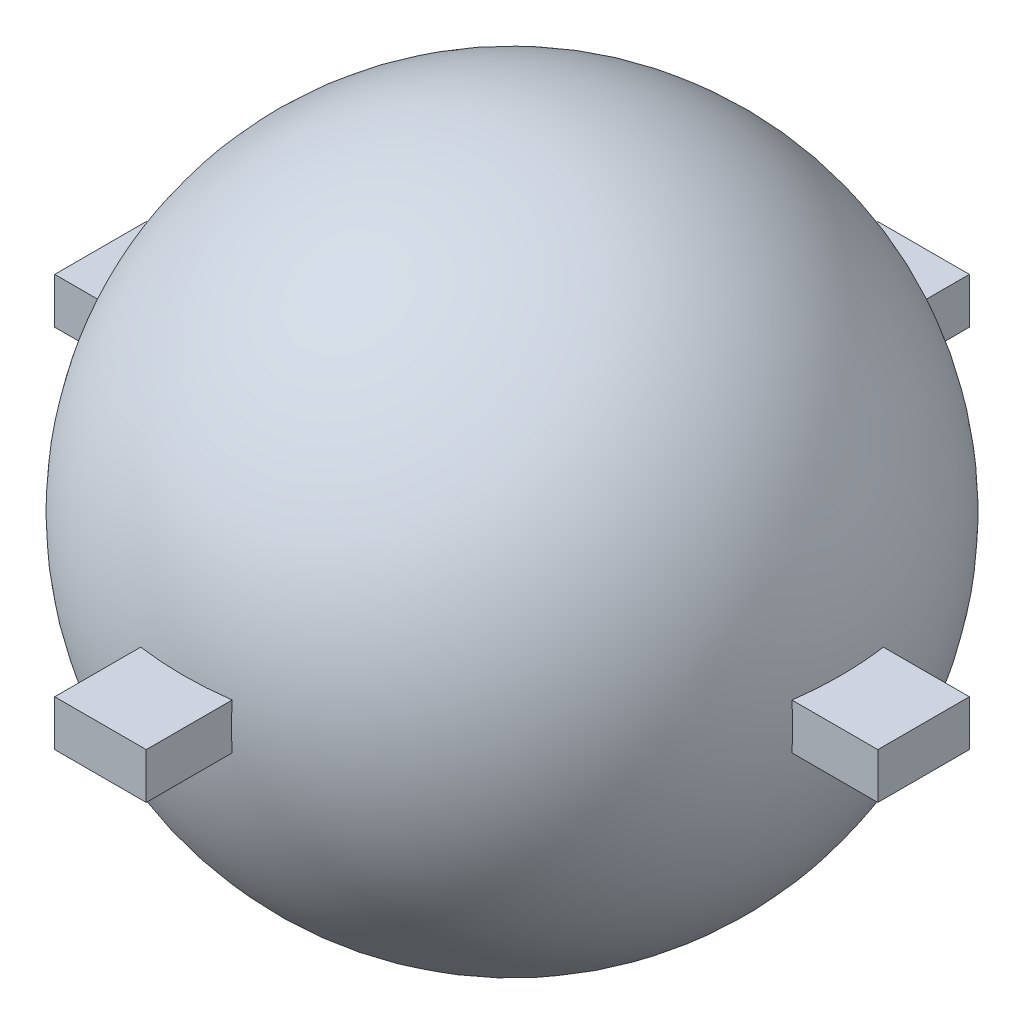
ISO-10303-21;
HEADER;
FILE_DESCRIPTION(('STEP AP214'),'2;1');
FILE_NAME('part.step','',(''),(''),'','','');
FILE_SCHEMA(('AUTOMOTIVE_DESIGN { 1 0 10303 214 1 1 1 1 }'));
ENDSEC;
DATA;
#1=APPLICATION_CONTEXT('core data for automotive mechanical design processes');
#2=APPLICATION_PROTOCOL_DEFINITION('international standard','automotive_design',2000,#1);
#3=PRODUCT_CONTEXT('',#1,'mechanical');
#4=PRODUCT('Part','Part','',(#3));
#5=PRODUCT_RELATED_PRODUCT_CATEGORY('part','',(#4));
#6=PRODUCT_DEFINITION_FORMATION('','',#4);
#7=PRODUCT_DEFINITION_CONTEXT('part definition',#1,'design');
#8=PRODUCT_DEFINITION('design','',#6,#7);
#9=PRODUCT_DEFINITION_SHAPE('','',#8);
#10=(LENGTH_UNIT() NAMED_UNIT(*) SI_UNIT(.MILLI.,.METRE.));
#11=(NAMED_UNIT(*) PLANE_ANGLE_UNIT() SI_UNIT($,.RADIAN.));
#12=(NAMED_UNIT(*) SI_UNIT($,.STERADIAN.) SOLID_ANGLE_UNIT());
#13=UNCERTAINTY_MEASURE_WITH_UNIT(LENGTH_MEASURE(1.E-05),#10,'distance_accuracy_value','');
#14=(GEOMETRIC_REPRESENTATION_CONTEXT(3) GLOBAL_UNCERTAINTY_ASSIGNED_CONTEXT((#13)) GLOBAL_UNIT_ASSIGNED_CONTEXT((#10,
#11,#12)) REPRESENTATION_CONTEXT('',''));
#15=CARTESIAN_POINT('',(0.,0.,0.));
#16=DIRECTION('',(0.,0.,1.));
#17=DIRECTION('',(1.,0.,0.));
#18=AXIS2_PLACEMENT_3D('',#15,#16,#17);
#19=CARTESIAN_POINT('',(0.,0.,342.5825));
#20=DIRECTION('',(0.,0.,-1.));
#21=DIRECTION('',(-1.,0.,0.));
#22=AXIS2_PLACEMENT_3D('',#19,#20,#21);
#23=PLANE('',#22);
#24=DIRECTION('',(0.,1.,0.));
#25=VECTOR('',#24,1.);
#26=CARTESIAN_POINT('',(38.1,-19.05,342.5825));
#27=LINE('',#26,#25);
#28=CARTESIAN_POINT('',(38.1,-19.05,342.5825));
#29=VERTEX_POINT('',#28);
#30=CARTESIAN_POINT('',(38.1,19.05,342.5825));
#31=VERTEX_POINT('',#30);
#32=EDGE_CURVE('E223',#29,#31,#27,.T.);
#33=ORIENTED_EDGE('',*,*,#32,.T.);
#34=DIRECTION('',(-1.,0.,0.));
#35=VECTOR('',#34,1.);
#36=CARTESIAN_POINT('',(-38.1,19.05,342.5825));
#37=LINE('',#36,#35);
#38=CARTESIAN_POINT('',(-38.1,19.05,342.5825));
#39=VERTEX_POINT('',#38);
#40=EDGE_CURVE('E258',#31,#39,#37,.T.);
#41=ORIENTED_EDGE('',*,*,#40,.T.);
#42=DIRECTION('',(0.,-1.,0.));
#43=VECTOR('',#42,1.);
#44=CARTESIAN_POINT('',(-38.1,-19.05,342.5825));
#45=LINE('',#44,#43);
#46=CARTESIAN_POINT('',(-38.1,-19.05,342.5825));
#47=VERTEX_POINT('',#46);
#48=EDGE_CURVE('E261',#39,#47,#45,.T.);
#49=ORIENTED_EDGE('',*,*,#48,.T.);
#50=DIRECTION('',(1.,0.,0.));
#51=VECTOR('',#50,1.);
#52=CARTESIAN_POINT('',(-38.1,-19.05,342.5825));
#53=LINE('',#52,#51);
#54=EDGE_CURVE('E264',#47,#29,#53,.T.);
#55=ORIENTED_EDGE('',*,*,#54,.T.);
#56=EDGE_LOOP('',(#33,#41,#49,#55));
#57=FACE_BOUND('',#56,.T.);
#58=ADVANCED_FACE('F37',(#57),#23,.F.);
#59=CARTESIAN_POINT('',(-38.1,19.05,-274.321));
#60=DIRECTION('',(0.,1.,0.));
#61=DIRECTION('',(0.,0.,1.));
#62=AXIS2_PLACEMENT_3D('',#59,#60,#61);
#63=PLANE('',#62);
#64=DIRECTION('',(0.,0.,1.));
#65=VECTOR('',#64,1.);
#66=CARTESIAN_POINT('',(38.1,19.05,-274.321));
#67=LINE('',#66,#65);
#68=CARTESIAN_POINT('',(38.1,19.05,270.992527387749));
#69=VERTEX_POINT('',#68);
#70=EDGE_CURVE('E267',#69,#31,#67,.T.);
#71=ORIENTED_EDGE('',*,*,#70,.F.);
#72=CARTESIAN_POINT('',(0.,19.05,0.));
#73=DIRECTION('',(0.,1.,0.));
#74=DIRECTION('',(0.,0.,1.));
#75=AXIS2_PLACEMENT_3D('',#72,#73,#74);
#76=CIRCLE('',#75,273.657742262118);
#77=CARTESIAN_POINT('',(-38.1,19.05,270.992527387749));
#78=VERTEX_POINT('',#77);
#79=EDGE_CURVE('E41',#69,#78,#76,.F.);
#80=ORIENTED_EDGE('',*,*,#79,.T.);
#81=DIRECTION('',(0.,0.,1.));
#82=VECTOR('',#81,1.);
#83=CARTESIAN_POINT('',(-38.1,19.05,-274.321));
#84=LINE('',#83,#82);
#85=EDGE_CURVE('E272',#78,#39,#84,.T.);
#86=ORIENTED_EDGE('',*,*,#85,.T.);
#87=ORIENTED_EDGE('',*,*,#40,.F.);
#88=EDGE_LOOP('',(#71,#80,#86,#87));
#89=FACE_BOUND('',#88,.T.);
#90=ADVANCED_FACE('F283',(#89),#63,.T.);
#91=CARTESIAN_POINT('',(-38.1,-19.05,-274.321));
#92=DIRECTION('',(-1.,0.,0.));
#93=DIRECTION('',(0.,0.,1.));
#94=AXIS2_PLACEMENT_3D('',#91,#92,#93);
#95=PLANE('',#94);
#96=ORIENTED_EDGE('',*,*,#85,.F.);
#97=CARTESIAN_POINT('',(-38.1,0.,0.));
#98=DIRECTION('',(-1.,0.,0.));
#99=DIRECTION('',(0.,0.,1.));
#100=AXIS2_PLACEMENT_3D('',#97,#98,#99);
#101=CIRCLE('',#100,271.661282482433);
#102=CARTESIAN_POINT('',(-38.1,-19.05,270.992527387749));
#103=VERTEX_POINT('',#102);
#104=EDGE_CURVE('E252',#78,#103,#101,.F.);
#105=ORIENTED_EDGE('',*,*,#104,.T.);
#106=DIRECTION('',(0.,0.,1.));
#107=VECTOR('',#106,1.);
#108=CARTESIAN_POINT('',(-38.1,-19.05,-274.321));
#109=LINE('',#108,#107);
#110=EDGE_CURVE('E270',#103,#47,#109,.T.);
#111=ORIENTED_EDGE('',*,*,#110,.T.);
#112=ORIENTED_EDGE('',*,*,#48,.F.);
#113=EDGE_LOOP('',(#96,#105,#111,#112));
#114=FACE_BOUND('',#113,.T.);
#115=ADVANCED_FACE('F294',(#114),#95,.T.);
#116=CARTESIAN_POINT('',(-38.1,-19.05,-274.321));
#117=DIRECTION('',(0.,-1.,0.));
#118=DIRECTION('',(0.,0.,-1.));
#119=AXIS2_PLACEMENT_3D('',#116,#117,#118);
#120=PLANE('',#119);
#121=ORIENTED_EDGE('',*,*,#110,.F.);
#122=CARTESIAN_POINT('',(0.,-19.05,0.));
#123=DIRECTION('',(0.,-1.,0.));
#124=DIRECTION('',(0.,0.,-1.));
#125=AXIS2_PLACEMENT_3D('',#122,#123,#124);
#126=CIRCLE('',#125,273.657742262118);
#127=CARTESIAN_POINT('',(38.1,-19.05,270.992527387749));
#128=VERTEX_POINT('',#127);
#129=EDGE_CURVE('E47',#103,#128,#126,.F.);
#130=ORIENTED_EDGE('',*,*,#129,.T.);
#131=DIRECTION('',(0.,0.,1.));
#132=VECTOR('',#131,1.);
#133=CARTESIAN_POINT('',(38.1,-19.05,-274.321));
#134=LINE('',#133,#132);
#135=EDGE_CURVE('E268',#128,#29,#134,.T.);
#136=ORIENTED_EDGE('',*,*,#135,.T.);
#137=ORIENTED_EDGE('',*,*,#54,.F.);
#138=EDGE_LOOP('',(#121,#130,#136,#137));
#139=FACE_BOUND('',#138,.T.);
#140=ADVANCED_FACE('F288',(#139),#120,.T.);
#141=CARTESIAN_POINT('',(38.1,-19.05,-274.321));
#142=DIRECTION('',(1.,0.,0.));
#143=DIRECTION('',(0.,0.,-1.));
#144=AXIS2_PLACEMENT_3D('',#141,#142,#143);
#145=PLANE('',#144);
#146=ORIENTED_EDGE('',*,*,#135,.F.);
#147=CARTESIAN_POINT('',(38.1,0.,0.));
#148=DIRECTION('',(1.,0.,0.));
#149=DIRECTION('',(0.,0.,-1.));
#150=AXIS2_PLACEMENT_3D('',#147,#148,#149);
#151=CIRCLE('',#150,271.661282482433);
#152=EDGE_CURVE('E11',#128,#69,#151,.F.);
#153=ORIENTED_EDGE('',*,*,#152,.T.);
#154=ORIENTED_EDGE('',*,*,#70,.T.);
#155=ORIENTED_EDGE('',*,*,#32,.F.);
#156=EDGE_LOOP('',(#146,#153,#154,#155));
#157=FACE_BOUND('',#156,.T.);
#158=ADVANCED_FACE('F278',(#157),#145,.T.);
#159=CARTESIAN_POINT('',(0.,0.,0.));
#160=DIRECTION('',(-1.,0.,0.));
#161=DIRECTION('',(0.,0.,-1.));
#162=AXIS2_PLACEMENT_3D('',#159,#160,#161);
#163=SPHERICAL_SURFACE('',#162,274.32);
#164=CARTESIAN_POINT('',(-3.9907631702977E-13,0.,38.1));
#165=DIRECTION('',(0.,0.,1.));
#166=DIRECTION('',(1.,0.,0.));
#167=AXIS2_PLACEMENT_3D('',#164,#165,#166);
#168=CIRCLE('',#167,271.661282482433);
#169=CARTESIAN_POINT('',(270.992527387749,19.05,38.1000000000028));
#170=VERTEX_POINT('',#169);
#171=CARTESIAN_POINT('',(270.992527387749,-19.05,38.1000000000028));
#172=VERTEX_POINT('',#171);
#173=EDGE_CURVE('E189',#170,#172,#168,.F.);
#174=ORIENTED_EDGE('',*,*,#173,.F.);
#175=CARTESIAN_POINT('',(0.,19.05,0.));
#176=DIRECTION('',(0.,1.,0.));
#177=DIRECTION('',(0.,0.,1.));
#178=AXIS2_PLACEMENT_3D('',#175,#176,#177);
#179=CIRCLE('',#178,273.657742262118);
#180=CARTESIAN_POINT('',(270.99252738775,19.05,-38.0999999999972));
#181=VERTEX_POINT('',#180);
#182=EDGE_CURVE('E184',#181,#170,#179,.F.);
#183=ORIENTED_EDGE('',*,*,#182,.F.);
#184=CARTESIAN_POINT('',(3.9907631702977E-13,0.,-38.1));
#185=DIRECTION('',(0.,0.,-1.));
#186=DIRECTION('',(-1.,0.,0.));
#187=AXIS2_PLACEMENT_3D('',#184,#185,#186);
#188=CIRCLE('',#187,271.661282482433);
#189=CARTESIAN_POINT('',(270.99252738775,-19.05,-38.0999999999972));
#190=VERTEX_POINT('',#189);
#191=EDGE_CURVE('E159',#190,#181,#188,.F.);
#192=ORIENTED_EDGE('',*,*,#191,.F.);
#193=CARTESIAN_POINT('',(0.,-19.05,0.));
#194=DIRECTION('',(0.,-1.,0.));
#195=DIRECTION('',(0.,0.,-1.));
#196=AXIS2_PLACEMENT_3D('',#193,#194,#195);
#197=CIRCLE('',#196,273.657742262118);
#198=EDGE_CURVE('E55',#172,#190,#197,.F.);
#199=ORIENTED_EDGE('',*,*,#198,.F.);
#200=EDGE_LOOP('',(#174,#183,#192,#199));
#201=FACE_BOUND('',#200,.T.);
#202=CARTESIAN_POINT('',(38.1,0.,0.));
#203=DIRECTION('',(1.,0.,0.));
#204=DIRECTION('',(0.,0.,-1.));
#205=AXIS2_PLACEMENT_3D('',#202,#203,#204);
#206=CIRCLE('',#205,271.661282482433);
#207=CARTESIAN_POINT('',(38.1,19.05,-270.992527387749));
#208=VERTEX_POINT('',#207);
#209=CARTESIAN_POINT('',(38.1,-19.05,-270.992527387749));
#210=VERTEX_POINT('',#209);
#211=EDGE_CURVE('E190',#208,#210,#206,.F.);
#212=ORIENTED_EDGE('',*,*,#211,.F.);
#213=CARTESIAN_POINT('',(0.,19.05,0.));
#214=DIRECTION('',(0.,1.,0.));
#215=DIRECTION('',(0.,0.,1.));
#216=AXIS2_PLACEMENT_3D('',#213,#214,#215);
#217=CIRCLE('',#216,273.657742262118);
#218=CARTESIAN_POINT('',(-38.1,19.05,-270.992527387749));
#219=VERTEX_POINT('',#218);
#220=EDGE_CURVE('E193',#219,#208,#217,.F.);
#221=ORIENTED_EDGE('',*,*,#220,.F.);
#222=CARTESIAN_POINT('',(-38.1,0.,0.));
#223=DIRECTION('',(-1.,0.,0.));
#224=DIRECTION('',(0.,0.,1.));
#225=AXIS2_PLACEMENT_3D('',#222,#223,#224);
#226=CIRCLE('',#225,271.661282482433);
#227=CARTESIAN_POINT('',(-38.1,-19.05,-270.992527387749));
#228=VERTEX_POINT('',#227);
#229=EDGE_CURVE('E195',#228,#219,#226,.F.);
#230=ORIENTED_EDGE('',*,*,#229,.F.);
#231=CARTESIAN_POINT('',(0.,-19.05,0.));
#232=DIRECTION('',(0.,-1.,0.));
#233=DIRECTION('',(0.,0.,-1.));
#234=AXIS2_PLACEMENT_3D('',#231,#232,#233);
#235=CIRCLE('',#234,273.657742262118);
#236=EDGE_CURVE('E63',#210,#228,#235,.F.);
#237=ORIENTED_EDGE('',*,*,#236,.F.);
#238=EDGE_LOOP('',(#212,#221,#230,#237));
#239=FACE_BOUND('',#238,.T.);
#240=CARTESIAN_POINT('',(0.,19.05,0.));
#241=DIRECTION('',(0.,1.,0.));
#242=DIRECTION('',(0.,0.,1.));
#243=AXIS2_PLACEMENT_3D('',#240,#241,#242);
#244=CIRCLE('',#243,273.657742262118);
#245=CARTESIAN_POINT('',(-270.992527387749,19.05,38.0999999999991));
#246=VERTEX_POINT('',#245);
#247=CARTESIAN_POINT('',(-270.992527387749,19.05,-38.1000000000009));
#248=VERTEX_POINT('',#247);
#249=EDGE_CURVE('E240',#246,#248,#244,.F.);
#250=ORIENTED_EDGE('',*,*,#249,.F.);
#251=CARTESIAN_POINT('',(-1.33025439009923E-13,0.,38.1));
#252=DIRECTION('',(0.,0.,1.));
#253=DIRECTION('',(1.,0.,0.));
#254=AXIS2_PLACEMENT_3D('',#251,#252,#253);
#255=CIRCLE('',#254,271.661282482433);
#256=CARTESIAN_POINT('',(-270.992527387749,-19.05,38.0999999999991));
#257=VERTEX_POINT('',#256);
#258=EDGE_CURVE('E197',#257,#246,#255,.F.);
#259=ORIENTED_EDGE('',*,*,#258,.F.);
#260=CARTESIAN_POINT('',(0.,-19.05,0.));
#261=DIRECTION('',(0.,-1.,0.));
#262=DIRECTION('',(0.,0.,-1.));
#263=AXIS2_PLACEMENT_3D('',#260,#261,#262);
#264=CIRCLE('',#263,273.657742262118);
#265=CARTESIAN_POINT('',(-270.992527387749,-19.05,-38.1000000000009));
#266=VERTEX_POINT('',#265);
#267=EDGE_CURVE('E237',#266,#257,#264,.F.);
#268=ORIENTED_EDGE('',*,*,#267,.F.);
#269=CARTESIAN_POINT('',(1.33025439009923E-13,0.,-38.1));
#270=DIRECTION('',(0.,0.,-1.));
#271=DIRECTION('',(-1.,0.,0.));
#272=AXIS2_PLACEMENT_3D('',#269,#270,#271);
#273=CIRCLE('',#272,271.661282482433);
#274=EDGE_CURVE('E236',#248,#266,#273,.F.);
#275=ORIENTED_EDGE('',*,*,#274,.F.);
#276=EDGE_LOOP('',(#250,#259,#268,#275));
#277=FACE_BOUND('',#276,.T.);
#278=ORIENTED_EDGE('',*,*,#104,.F.);
#279=ORIENTED_EDGE('',*,*,#79,.F.);
#280=ORIENTED_EDGE('',*,*,#152,.F.);
#281=ORIENTED_EDGE('',*,*,#129,.F.);
#282=EDGE_LOOP('',(#278,#279,#280,#281));
#283=FACE_BOUND('',#282,.T.);
#284=ADVANCED_FACE('F292',(#201,#239,#277,#283),#163,.T.);
#285=CARTESIAN_POINT('',(274.321000000001,-19.05,38.100000000001));
#286=DIRECTION('',(0.,0.,1.));
#287=DIRECTION('',(1.,0.,0.));
#288=AXIS2_PLACEMENT_3D('',#285,#286,#287);
#289=PLANE('',#288);
#290=DIRECTION('',(-1.,0.,0.));
#291=VECTOR('',#290,1.);
#292=CARTESIAN_POINT('',(274.321000000001,-19.05,38.100000000001));
#293=LINE('',#292,#291);
#294=CARTESIAN_POINT('',(-342.5825,-19.05,38.0999999999988));
#295=VERTEX_POINT('',#294);
#296=EDGE_CURVE('E234',#257,#295,#293,.T.);
#297=ORIENTED_EDGE('',*,*,#296,.F.);
#298=ORIENTED_EDGE('',*,*,#258,.T.);
#299=DIRECTION('',(-1.,0.,0.));
#300=VECTOR('',#299,1.);
#301=CARTESIAN_POINT('',(274.321000000001,19.05,38.100000000001));
#302=LINE('',#301,#300);
#303=CARTESIAN_POINT('',(-342.5825,19.05,38.0999999999988));
#304=VERTEX_POINT('',#303);
#305=EDGE_CURVE('E242',#246,#304,#302,.T.);
#306=ORIENTED_EDGE('',*,*,#305,.T.);
#307=DIRECTION('',(0.,1.,0.));
#308=VECTOR('',#307,1.);
#309=CARTESIAN_POINT('',(-342.5825,-19.05,38.0999999999988));
#310=LINE('',#309,#308);
#311=EDGE_CURVE('E230',#295,#304,#310,.T.);
#312=ORIENTED_EDGE('',*,*,#311,.F.);
#313=EDGE_LOOP('',(#297,#298,#306,#312));
#314=FACE_BOUND('',#313,.T.);
#315=ADVANCED_FACE('F320',(#314),#289,.T.);
#316=CARTESIAN_POINT('',(274.321000000001,-19.05,-38.099999999999));
#317=DIRECTION('',(0.,-1.,0.));
#318=DIRECTION('',(0.,0.,-1.));
#319=AXIS2_PLACEMENT_3D('',#316,#317,#318);
#320=PLANE('',#319);
#321=DIRECTION('',(-1.,0.,0.));
#322=VECTOR('',#321,1.);
#323=CARTESIAN_POINT('',(274.321000000001,-19.05,-38.099999999999));
#324=LINE('',#323,#322);
#325=CARTESIAN_POINT('',(-342.5825,-19.05,-38.1000000000012));
#326=VERTEX_POINT('',#325);
#327=EDGE_CURVE('E238',#266,#326,#324,.T.);
#328=ORIENTED_EDGE('',*,*,#327,.F.);
#329=ORIENTED_EDGE('',*,*,#267,.T.);
#330=ORIENTED_EDGE('',*,*,#296,.T.);
#331=DIRECTION('',(0.,0.,1.));
#332=VECTOR('',#331,1.);
#333=CARTESIAN_POINT('',(-342.5825,-19.05,-38.1000000000012));
#334=LINE('',#333,#332);
#335=EDGE_CURVE('E220',#326,#295,#334,.T.);
#336=ORIENTED_EDGE('',*,*,#335,.F.);
#337=EDGE_LOOP('',(#328,#329,#330,#336));
#338=FACE_BOUND('',#337,.T.);
#339=ADVANCED_FACE('F316',(#338),#320,.T.);
#340=CARTESIAN_POINT('',(274.321000000001,-19.05,-38.099999999999));
#341=DIRECTION('',(0.,0.,-1.));
#342=DIRECTION('',(-1.,0.,0.));
#343=AXIS2_PLACEMENT_3D('',#340,#341,#342);
#344=PLANE('',#343);
#345=DIRECTION('',(-1.,0.,0.));
#346=VECTOR('',#345,1.);
#347=CARTESIAN_POINT('',(274.321000000001,19.05,-38.099999999999));
#348=LINE('',#347,#346);
#349=CARTESIAN_POINT('',(-342.5825,19.05,-38.1000000000012));
#350=VERTEX_POINT('',#349);
#351=EDGE_CURVE('E233',#248,#350,#348,.T.);
#352=ORIENTED_EDGE('',*,*,#351,.F.);
#353=ORIENTED_EDGE('',*,*,#274,.T.);
#354=ORIENTED_EDGE('',*,*,#327,.T.);
#355=DIRECTION('',(0.,-1.,0.));
#356=VECTOR('',#355,1.);
#357=CARTESIAN_POINT('',(-342.5825,-19.05,-38.1000000000012));
#358=LINE('',#357,#356);
#359=EDGE_CURVE('E224',#350,#326,#358,.T.);
#360=ORIENTED_EDGE('',*,*,#359,.F.);
#361=EDGE_LOOP('',(#352,#353,#354,#360));
#362=FACE_BOUND('',#361,.T.);
#363=ADVANCED_FACE('F312',(#362),#344,.T.);
#364=CARTESIAN_POINT('',(274.321000000001,19.05,-38.099999999999));
#365=DIRECTION('',(0.,1.,0.));
#366=DIRECTION('',(0.,0.,1.));
#367=AXIS2_PLACEMENT_3D('',#364,#365,#366);
#368=PLANE('',#367);
#369=ORIENTED_EDGE('',*,*,#305,.F.);
#370=ORIENTED_EDGE('',*,*,#249,.T.);
#371=ORIENTED_EDGE('',*,*,#351,.T.);
#372=DIRECTION('',(0.,0.,-1.));
#373=VECTOR('',#372,1.);
#374=CARTESIAN_POINT('',(-342.5825,19.05,-38.1000000000012));
#375=LINE('',#374,#373);
#376=EDGE_CURVE('E227',#304,#350,#375,.T.);
#377=ORIENTED_EDGE('',*,*,#376,.F.);
#378=EDGE_LOOP('',(#369,#370,#371,#377));
#379=FACE_BOUND('',#378,.T.);
#380=ADVANCED_FACE('F308',(#379),#368,.T.);
#381=CARTESIAN_POINT('',(-342.5825,0.,-1.19612040576423E-12));
#382=DIRECTION('',(1.,0.,0.));
#383=DIRECTION('',(0.,0.,-1.));
#384=AXIS2_PLACEMENT_3D('',#381,#382,#383);
#385=PLANE('',#384);
#386=ORIENTED_EDGE('',*,*,#311,.T.);
#387=ORIENTED_EDGE('',*,*,#376,.T.);
#388=ORIENTED_EDGE('',*,*,#359,.T.);
#389=ORIENTED_EDGE('',*,*,#335,.T.);
#390=EDGE_LOOP('',(#386,#387,#388,#389));
#391=FACE_BOUND('',#390,.T.);
#392=ADVANCED_FACE('F311',(#391),#385,.F.);
#393=CARTESIAN_POINT('',(0.,0.,-342.5825));
#394=DIRECTION('',(0.,0.,1.));
#395=DIRECTION('',(1.,0.,0.));
#396=AXIS2_PLACEMENT_3D('',#393,#394,#395);
#397=PLANE('',#396);
#398=DIRECTION('',(0.,1.,0.));
#399=VECTOR('',#398,1.);
#400=CARTESIAN_POINT('',(-38.1,-19.05,-342.5825));
#401=LINE('',#400,#399);
#402=CARTESIAN_POINT('',(-38.1,-19.05,-342.5825));
#403=VERTEX_POINT('',#402);
#404=CARTESIAN_POINT('',(-38.1,19.05,-342.5825));
#405=VERTEX_POINT('',#404);
#406=EDGE_CURVE('E198',#403,#405,#401,.T.);
#407=ORIENTED_EDGE('',*,*,#406,.T.);
#408=DIRECTION('',(1.,0.,0.));
#409=VECTOR('',#408,1.);
#410=CARTESIAN_POINT('',(38.1,19.05,-342.5825));
#411=LINE('',#410,#409);
#412=CARTESIAN_POINT('',(38.1,19.05,-342.5825));
#413=VERTEX_POINT('',#412);
#414=EDGE_CURVE('E201',#405,#413,#411,.T.);
#415=ORIENTED_EDGE('',*,*,#414,.T.);
#416=DIRECTION('',(0.,-1.,0.));
#417=VECTOR('',#416,1.);
#418=CARTESIAN_POINT('',(38.1,-19.05,-342.5825));
#419=LINE('',#418,#417);
#420=CARTESIAN_POINT('',(38.1,-19.05,-342.5825));
#421=VERTEX_POINT('',#420);
#422=EDGE_CURVE('E204',#413,#421,#419,.T.);
#423=ORIENTED_EDGE('',*,*,#422,.T.);
#424=DIRECTION('',(-1.,0.,0.));
#425=VECTOR('',#424,1.);
#426=CARTESIAN_POINT('',(38.1,-19.05,-342.5825));
#427=LINE('',#426,#425);
#428=EDGE_CURVE('E207',#421,#403,#427,.T.);
#429=ORIENTED_EDGE('',*,*,#428,.T.);
#430=EDGE_LOOP('',(#407,#415,#423,#429));
#431=FACE_BOUND('',#430,.T.);
#432=ADVANCED_FACE('F327',(#431),#397,.F.);
#433=CARTESIAN_POINT('',(38.1,19.05,342.5835));
#434=DIRECTION('',(0.,1.,0.));
#435=DIRECTION('',(0.,0.,1.));
#436=AXIS2_PLACEMENT_3D('',#433,#434,#435);
#437=PLANE('',#436);
#438=DIRECTION('',(0.,0.,-1.));
#439=VECTOR('',#438,1.);
#440=CARTESIAN_POINT('',(-38.1,19.05,342.5835));
#441=LINE('',#440,#439);
#442=EDGE_CURVE('E210',#219,#405,#441,.T.);
#443=ORIENTED_EDGE('',*,*,#442,.F.);
#444=ORIENTED_EDGE('',*,*,#220,.T.);
#445=DIRECTION('',(0.,0.,-1.));
#446=VECTOR('',#445,1.);
#447=CARTESIAN_POINT('',(38.1,19.05,342.5835));
#448=LINE('',#447,#446);
#449=EDGE_CURVE('E215',#208,#413,#448,.T.);
#450=ORIENTED_EDGE('',*,*,#449,.T.);
#451=ORIENTED_EDGE('',*,*,#414,.F.);
#452=EDGE_LOOP('',(#443,#444,#450,#451));
#453=FACE_BOUND('',#452,.T.);
#454=ADVANCED_FACE('F334',(#453),#437,.T.);
#455=CARTESIAN_POINT('',(38.1,-19.05,342.5835));
#456=DIRECTION('',(1.,0.,0.));
#457=DIRECTION('',(0.,0.,-1.));
#458=AXIS2_PLACEMENT_3D('',#455,#456,#457);
#459=PLANE('',#458);
#460=ORIENTED_EDGE('',*,*,#449,.F.);
#461=ORIENTED_EDGE('',*,*,#211,.T.);
#462=DIRECTION('',(0.,0.,-1.));
#463=VECTOR('',#462,1.);
#464=CARTESIAN_POINT('',(38.1,-19.05,342.5835));
#465=LINE('',#464,#463);
#466=EDGE_CURVE('E213',#210,#421,#465,.T.);
#467=ORIENTED_EDGE('',*,*,#466,.T.);
#468=ORIENTED_EDGE('',*,*,#422,.F.);
#469=EDGE_LOOP('',(#460,#461,#467,#468));
#470=FACE_BOUND('',#469,.T.);
#471=ADVANCED_FACE('F337',(#470),#459,.T.);
#472=CARTESIAN_POINT('',(38.1,-19.05,342.5835));
#473=DIRECTION('',(0.,-1.,0.));
#474=DIRECTION('',(0.,0.,-1.));
#475=AXIS2_PLACEMENT_3D('',#472,#473,#474);
#476=PLANE('',#475);
#477=ORIENTED_EDGE('',*,*,#466,.F.);
#478=ORIENTED_EDGE('',*,*,#236,.T.);
#479=DIRECTION('',(0.,0.,-1.));
#480=VECTOR('',#479,1.);
#481=CARTESIAN_POINT('',(-38.1,-19.05,342.5835));
#482=LINE('',#481,#480);
#483=EDGE_CURVE('E211',#228,#403,#482,.T.);
#484=ORIENTED_EDGE('',*,*,#483,.T.);
#485=ORIENTED_EDGE('',*,*,#428,.F.);
#486=EDGE_LOOP('',(#477,#478,#484,#485));
#487=FACE_BOUND('',#486,.T.);
#488=ADVANCED_FACE('F332',(#487),#476,.T.);
#489=CARTESIAN_POINT('',(-38.1,-19.05,342.5835));
#490=DIRECTION('',(-1.,0.,0.));
#491=DIRECTION('',(0.,0.,1.));
#492=AXIS2_PLACEMENT_3D('',#489,#490,#491);
#493=PLANE('',#492);
#494=ORIENTED_EDGE('',*,*,#483,.F.);
#495=ORIENTED_EDGE('',*,*,#229,.T.);
#496=ORIENTED_EDGE('',*,*,#442,.T.);
#497=ORIENTED_EDGE('',*,*,#406,.F.);
#498=EDGE_LOOP('',(#494,#495,#496,#497));
#499=FACE_BOUND('',#498,.T.);
#500=ADVANCED_FACE('F329',(#499),#493,.T.);
#501=CARTESIAN_POINT('',(342.5825,0.,3.58836121729268E-12));
#502=DIRECTION('',(-1.,0.,0.));
#503=DIRECTION('',(0.,0.,1.));
#504=AXIS2_PLACEMENT_3D('',#501,#502,#503);
#505=PLANE('',#504);
#506=DIRECTION('',(0.,1.,0.));
#507=VECTOR('',#506,1.);
#508=CARTESIAN_POINT('',(342.5825,-19.05,-38.0999999999964));
#509=LINE('',#508,#507);
#510=CARTESIAN_POINT('',(342.5825,-19.05,-38.0999999999964));
#511=VERTEX_POINT('',#510);
#512=CARTESIAN_POINT('',(342.5825,19.05,-38.0999999999964));
#513=VERTEX_POINT('',#512);
#514=EDGE_CURVE('E156',#511,#513,#509,.T.);
#515=ORIENTED_EDGE('',*,*,#514,.T.);
#516=DIRECTION('',(0.,0.,1.));
#517=VECTOR('',#516,1.);
#518=CARTESIAN_POINT('',(342.5825,19.05,38.1000000000036));
#519=LINE('',#518,#517);
#520=CARTESIAN_POINT('',(342.5825,19.05,38.1000000000036));
#521=VERTEX_POINT('',#520);
#522=EDGE_CURVE('E167',#513,#521,#519,.T.);
#523=ORIENTED_EDGE('',*,*,#522,.T.);
#524=DIRECTION('',(0.,-1.,0.));
#525=VECTOR('',#524,1.);
#526=CARTESIAN_POINT('',(342.5825,-19.05,38.1000000000036));
#527=LINE('',#526,#525);
#528=CARTESIAN_POINT('',(342.5825,-19.05,38.1000000000036));
#529=VERTEX_POINT('',#528);
#530=EDGE_CURVE('E172',#521,#529,#527,.T.);
#531=ORIENTED_EDGE('',*,*,#530,.T.);
#532=DIRECTION('',(0.,0.,-1.));
#533=VECTOR('',#532,1.);
#534=CARTESIAN_POINT('',(342.5825,-19.05,38.1000000000036));
#535=LINE('',#534,#533);
#536=EDGE_CURVE('E164',#529,#511,#535,.T.);
#537=ORIENTED_EDGE('',*,*,#536,.T.);
#538=EDGE_LOOP('',(#515,#523,#531,#537));
#539=FACE_BOUND('',#538,.T.);
#540=ADVANCED_FACE('F174',(#539),#505,.F.);
#541=CARTESIAN_POINT('',(-274.321000000003,19.05,38.0999999999971));
#542=DIRECTION('',(0.,1.,0.));
#543=DIRECTION('',(0.,0.,1.));
#544=AXIS2_PLACEMENT_3D('',#541,#542,#543);
#545=PLANE('',#544);
#546=DIRECTION('',(1.,0.,0.));
#547=VECTOR('',#546,1.);
#548=CARTESIAN_POINT('',(-274.321000000002,19.05,-38.1000000000029));
#549=LINE('',#548,#547);
#550=EDGE_CURVE('E152',#181,#513,#549,.T.);
#551=ORIENTED_EDGE('',*,*,#550,.F.);
#552=ORIENTED_EDGE('',*,*,#182,.T.);
#553=DIRECTION('',(1.,0.,0.));
#554=VECTOR('',#553,1.);
#555=CARTESIAN_POINT('',(-274.321000000003,19.05,38.0999999999971));
#556=LINE('',#555,#554);
#557=EDGE_CURVE('E163',#170,#521,#556,.T.);
#558=ORIENTED_EDGE('',*,*,#557,.T.);
#559=ORIENTED_EDGE('',*,*,#522,.F.);
#560=EDGE_LOOP('',(#551,#552,#558,#559));
#561=FACE_BOUND('',#560,.T.);
#562=ADVANCED_FACE('F168',(#561),#545,.T.);
#563=CARTESIAN_POINT('',(-274.321000000003,-19.05,38.0999999999971));
#564=DIRECTION('',(0.,0.,1.));
#565=DIRECTION('',(1.,0.,0.));
#566=AXIS2_PLACEMENT_3D('',#563,#564,#565);
#567=PLANE('',#566);
#568=ORIENTED_EDGE('',*,*,#557,.F.);
#569=ORIENTED_EDGE('',*,*,#173,.T.);
#570=DIRECTION('',(1.,0.,0.));
#571=VECTOR('',#570,1.);
#572=CARTESIAN_POINT('',(-274.321000000003,-19.05,38.0999999999971));
#573=LINE('',#572,#571);
#574=EDGE_CURVE('E185',#172,#529,#573,.T.);
#575=ORIENTED_EDGE('',*,*,#574,.T.);
#576=ORIENTED_EDGE('',*,*,#530,.F.);
#577=EDGE_LOOP('',(#568,#569,#575,#576));
#578=FACE_BOUND('',#577,.T.);
#579=ADVANCED_FACE('F352',(#578),#567,.T.);
#580=CARTESIAN_POINT('',(-274.321000000003,-19.05,38.0999999999971));
#581=DIRECTION('',(0.,-1.,0.));
#582=DIRECTION('',(0.,0.,-1.));
#583=AXIS2_PLACEMENT_3D('',#580,#581,#582);
#584=PLANE('',#583);
#585=ORIENTED_EDGE('',*,*,#574,.F.);
#586=ORIENTED_EDGE('',*,*,#198,.T.);
#587=DIRECTION('',(1.,0.,0.));
#588=VECTOR('',#587,1.);
#589=CARTESIAN_POINT('',(-274.321000000002,-19.05,-38.1000000000029));
#590=LINE('',#589,#588);
#591=EDGE_CURVE('E182',#190,#511,#590,.T.);
#592=ORIENTED_EDGE('',*,*,#591,.T.);
#593=ORIENTED_EDGE('',*,*,#536,.F.);
#594=EDGE_LOOP('',(#585,#586,#592,#593));
#595=FACE_BOUND('',#594,.T.);
#596=ADVANCED_FACE('F349',(#595),#584,.T.);
#597=CARTESIAN_POINT('',(-274.321000000002,-19.05,-38.1000000000029));
#598=DIRECTION('',(0.,0.,-1.));
#599=DIRECTION('',(-1.,0.,0.));
#600=AXIS2_PLACEMENT_3D('',#597,#598,#599);
#601=PLANE('',#600);
#602=ORIENTED_EDGE('',*,*,#591,.F.);
#603=ORIENTED_EDGE('',*,*,#191,.T.);
#604=ORIENTED_EDGE('',*,*,#550,.T.);
#605=ORIENTED_EDGE('',*,*,#514,.F.);
#606=EDGE_LOOP('',(#602,#603,#604,#605));
#607=FACE_BOUND('',#606,.T.);
#608=ADVANCED_FACE('F154',(#607),#601,.T.);
#609=CLOSED_SHELL('',(#58,#90,#115,#140,#158,#284,#315,#339,#363,#380,#392,#432,#454,#471,#488,
#500,#540,#562,#579,#596,#608));
#610=CARTESIAN_POINT('',(0.,0.,0.));
#611=DIRECTION('',(-1.,0.,0.));
#612=DIRECTION('',(0.,0.,-1.));
#613=AXIS2_PLACEMENT_3D('',#610,#611,#612);
#614=SPHERICAL_SURFACE('',#613,271.145);
#615=CARTESIAN_POINT('',(-271.145,0.,0.));
#616=VERTEX_POINT('',#615);
#617=VERTEX_LOOP('',#616);
#618=FACE_BOUND('',#617,.T.);
#619=ADVANCED_FACE('F39',(#618),#614,.F.);
#620=CLOSED_SHELL('',(#619));
#621=ORIENTED_CLOSED_SHELL('',*,#620,.T.);
#622=BREP_WITH_VOIDS('B2',#609,(#621));
#623=ADVANCED_BREP_SHAPE_REPRESENTATION('',(#18,#622),#14);
#624=SHAPE_DEFINITION_REPRESENTATION(#9,#623);
ENDSEC;
END-ISO-10303-21;
